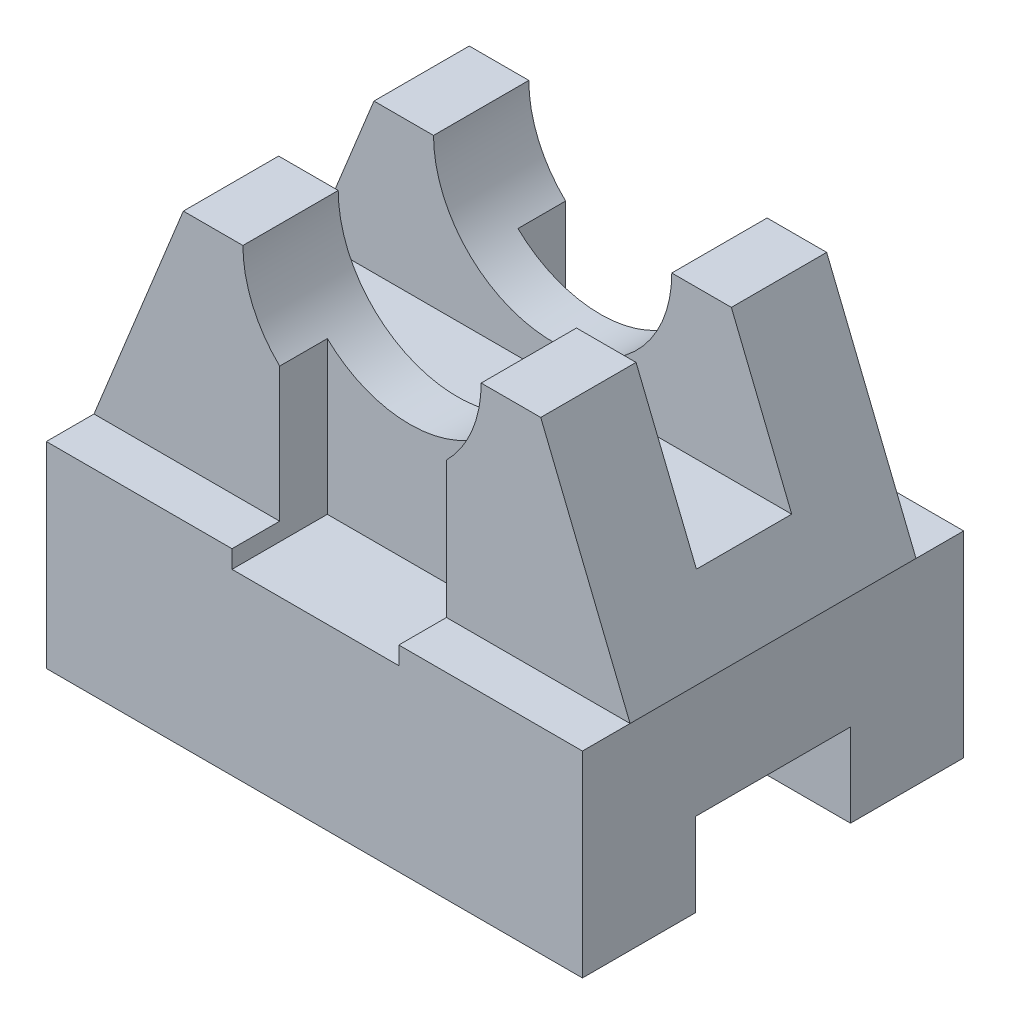
ISO-10303-21;
HEADER;
FILE_DESCRIPTION(('STEP AP214'),'2;1');
FILE_NAME('part.step','',(''),(''),'','','');
FILE_SCHEMA(('AUTOMOTIVE_DESIGN { 1 0 10303 214 1 1 1 1 }'));
ENDSEC;
DATA;
#1=APPLICATION_CONTEXT('core data for automotive mechanical design processes');
#2=APPLICATION_PROTOCOL_DEFINITION('international standard','automotive_design',2000,#1);
#3=PRODUCT_CONTEXT('',#1,'mechanical');
#4=PRODUCT('Part','Part','',(#3));
#5=PRODUCT_RELATED_PRODUCT_CATEGORY('part','',(#4));
#6=PRODUCT_DEFINITION_FORMATION('','',#4);
#7=PRODUCT_DEFINITION_CONTEXT('part definition',#1,'design');
#8=PRODUCT_DEFINITION('design','',#6,#7);
#9=PRODUCT_DEFINITION_SHAPE('','',#8);
#10=(LENGTH_UNIT() NAMED_UNIT(*) SI_UNIT(.MILLI.,.METRE.));
#11=(NAMED_UNIT(*) PLANE_ANGLE_UNIT() SI_UNIT($,.RADIAN.));
#12=(NAMED_UNIT(*) SI_UNIT($,.STERADIAN.) SOLID_ANGLE_UNIT());
#13=UNCERTAINTY_MEASURE_WITH_UNIT(LENGTH_MEASURE(1.E-05),#10,'distance_accuracy_value','');
#14=(GEOMETRIC_REPRESENTATION_CONTEXT(3) GLOBAL_UNCERTAINTY_ASSIGNED_CONTEXT((#13)) GLOBAL_UNIT_ASSIGNED_CONTEXT((#10,
#11,#12)) REPRESENTATION_CONTEXT('',''));
#15=CARTESIAN_POINT('',(0.,0.,0.));
#16=DIRECTION('',(0.,0.,1.));
#17=DIRECTION('',(1.,0.,0.));
#18=AXIS2_PLACEMENT_3D('',#15,#16,#17);
#19=CARTESIAN_POINT('',(0.,70.,24.));
#20=DIRECTION('',(0.,0.,-1.));
#21=DIRECTION('',(-1.,0.,0.));
#22=AXIS2_PLACEMENT_3D('',#19,#20,#21);
#23=CYLINDRICAL_SURFACE('',#22,20.);
#24=CARTESIAN_POINT('',(0.,70.,-16.));
#25=DIRECTION('',(0.,0.,-1.));
#26=DIRECTION('',(-1.,0.,0.));
#27=AXIS2_PLACEMENT_3D('',#24,#25,#26);
#28=CIRCLE('',#27,20.);
#29=CARTESIAN_POINT('',(14.1737173631196,55.8895168009595,-16.));
#30=VERTEX_POINT('',#29);
#31=CARTESIAN_POINT('',(-13.8262826368804,55.5489132434582,-16.));
#32=VERTEX_POINT('',#31);
#33=EDGE_CURVE('E11',#30,#32,#28,.T.);
#34=ORIENTED_EDGE('',*,*,#33,.T.);
#35=DIRECTION('',(0.,0.,-1.));
#36=VECTOR('',#35,1.);
#37=CARTESIAN_POINT('',(-13.8262826368804,55.5489132434582,24.));
#38=LINE('',#37,#36);
#39=CARTESIAN_POINT('',(-13.8262826368804,55.5489132434582,-24.));
#40=VERTEX_POINT('',#39);
#41=EDGE_CURVE('E262',#32,#40,#38,.T.);
#42=ORIENTED_EDGE('',*,*,#41,.T.);
#43=CARTESIAN_POINT('',(0.,70.,-24.));
#44=DIRECTION('',(0.,0.,1.));
#45=DIRECTION('',(1.,0.,0.));
#46=AXIS2_PLACEMENT_3D('',#43,#44,#45);
#47=CIRCLE('',#46,20.);
#48=CARTESIAN_POINT('',(-20.,70.,-24.));
#49=VERTEX_POINT('',#48);
#50=EDGE_CURVE('E375',#49,#40,#47,.T.);
#51=ORIENTED_EDGE('',*,*,#50,.F.);
#52=DIRECTION('',(0.,0.,-1.));
#53=VECTOR('',#52,1.);
#54=CARTESIAN_POINT('',(-20.,70.,24.));
#55=LINE('',#54,#53);
#56=CARTESIAN_POINT('',(-20.,70.,-8.));
#57=VERTEX_POINT('',#56);
#58=EDGE_CURVE('E355',#57,#49,#55,.T.);
#59=ORIENTED_EDGE('',*,*,#58,.F.);
#60=CARTESIAN_POINT('',(0.,70.,-8.));
#61=DIRECTION('',(0.,0.,-1.));
#62=DIRECTION('',(-1.,0.,0.));
#63=AXIS2_PLACEMENT_3D('',#60,#61,#62);
#64=CIRCLE('',#63,20.);
#65=CARTESIAN_POINT('',(20.,70.,-8.));
#66=VERTEX_POINT('',#65);
#67=EDGE_CURVE('E335',#66,#57,#64,.T.);
#68=ORIENTED_EDGE('',*,*,#67,.F.);
#69=DIRECTION('',(0.,0.,-1.));
#70=VECTOR('',#69,1.);
#71=CARTESIAN_POINT('',(20.,70.,24.));
#72=LINE('',#71,#70);
#73=CARTESIAN_POINT('',(20.,70.,-24.));
#74=VERTEX_POINT('',#73);
#75=EDGE_CURVE('E374',#66,#74,#72,.T.);
#76=ORIENTED_EDGE('',*,*,#75,.T.);
#77=CARTESIAN_POINT('',(14.1737173631196,55.8895168009595,-24.));
#78=VERTEX_POINT('',#77);
#79=EDGE_CURVE('E359',#78,#74,#47,.T.);
#80=ORIENTED_EDGE('',*,*,#79,.F.);
#81=DIRECTION('',(0.,0.,-1.));
#82=VECTOR('',#81,1.);
#83=CARTESIAN_POINT('',(14.1737173631196,55.8895168009595,24.));
#84=LINE('',#83,#82);
#85=EDGE_CURVE('E50',#78,#30,#84,.F.);
#86=ORIENTED_EDGE('',*,*,#85,.T.);
#87=EDGE_LOOP('',(#34,#42,#51,#59,#68,#76,#80,#86));
#88=FACE_BOUND('',#87,.T.);
#89=ADVANCED_FACE('F35',(#88),#23,.F.);
#90=CARTESIAN_POINT('',(0.,33.,0.));
#91=DIRECTION('',(0.,1.,0.));
#92=DIRECTION('',(0.,0.,1.));
#93=AXIS2_PLACEMENT_3D('',#90,#91,#92);
#94=PLANE('',#93);
#95=DIRECTION('',(-1.,0.,0.));
#96=VECTOR('',#95,1.);
#97=CARTESIAN_POINT('',(0.,33.,-24.));
#98=LINE('',#97,#96);
#99=CARTESIAN_POINT('',(-13.8262826368804,33.,-24.));
#100=VERTEX_POINT('',#99);
#101=CARTESIAN_POINT('',(-45.,33.,-24.));
#102=VERTEX_POINT('',#101);
#103=EDGE_CURVE('E378',#100,#102,#98,.T.);
#104=ORIENTED_EDGE('',*,*,#103,.F.);
#105=DIRECTION('',(0.,0.,-1.));
#106=VECTOR('',#105,1.);
#107=CARTESIAN_POINT('',(-13.8262826368804,33.,0.));
#108=LINE('',#107,#106);
#109=CARTESIAN_POINT('',(-13.8262826368804,33.,-32.));
#110=VERTEX_POINT('',#109);
#111=EDGE_CURVE('E281',#100,#110,#108,.T.);
#112=ORIENTED_EDGE('',*,*,#111,.T.);
#113=DIRECTION('',(-1.,0.,0.));
#114=VECTOR('',#113,1.);
#115=CARTESIAN_POINT('',(-45.,33.,-32.));
#116=LINE('',#115,#114);
#117=CARTESIAN_POINT('',(-45.,33.,-32.));
#118=VERTEX_POINT('',#117);
#119=EDGE_CURVE('E427',#110,#118,#116,.T.);
#120=ORIENTED_EDGE('',*,*,#119,.T.);
#121=DIRECTION('',(0.,0.,1.));
#122=VECTOR('',#121,1.);
#123=CARTESIAN_POINT('',(-45.,33.,-32.));
#124=LINE('',#123,#122);
#125=EDGE_CURVE('E433',#118,#102,#124,.T.);
#126=ORIENTED_EDGE('',*,*,#125,.T.);
#127=EDGE_LOOP('',(#104,#112,#120,#126));
#128=FACE_BOUND('',#127,.T.);
#129=ADVANCED_FACE('F531',(#128),#94,.T.);
#130=CARTESIAN_POINT('',(45.,33.,-32.));
#131=VERTEX_POINT('',#130);
#132=CARTESIAN_POINT('',(14.1737173631196,33.,-32.));
#133=VERTEX_POINT('',#132);
#134=EDGE_CURVE('E429',#131,#133,#116,.T.);
#135=ORIENTED_EDGE('',*,*,#134,.T.);
#136=DIRECTION('',(0.,0.,1.));
#137=VECTOR('',#136,1.);
#138=CARTESIAN_POINT('',(14.1737173631196,33.,0.));
#139=LINE('',#138,#137);
#140=CARTESIAN_POINT('',(14.1737173631196,33.,-24.));
#141=VERTEX_POINT('',#140);
#142=EDGE_CURVE('E273',#133,#141,#139,.T.);
#143=ORIENTED_EDGE('',*,*,#142,.T.);
#144=CARTESIAN_POINT('',(45.,33.,-24.));
#145=VERTEX_POINT('',#144);
#146=EDGE_CURVE('E379',#145,#141,#98,.T.);
#147=ORIENTED_EDGE('',*,*,#146,.F.);
#148=DIRECTION('',(0.,0.,-1.));
#149=VECTOR('',#148,1.);
#150=CARTESIAN_POINT('',(45.,33.,-32.));
#151=LINE('',#150,#149);
#152=EDGE_CURVE('E428',#145,#131,#151,.T.);
#153=ORIENTED_EDGE('',*,*,#152,.T.);
#154=EDGE_LOOP('',(#135,#143,#147,#153));
#155=FACE_BOUND('',#154,.T.);
#156=ADVANCED_FACE('F507',(#155),#94,.T.);
#157=CARTESIAN_POINT('',(-45.,33.,-32.));
#158=DIRECTION('',(0.,0.,1.));
#159=DIRECTION('',(1.,0.,0.));
#160=AXIS2_PLACEMENT_3D('',#157,#158,#159);
#161=PLANE('',#160);
#162=DIRECTION('',(0.,1.,0.));
#163=VECTOR('',#162,1.);
#164=CARTESIAN_POINT('',(-13.8262826368804,30.,-32.));
#165=LINE('',#164,#163);
#166=CARTESIAN_POINT('',(-13.8262826368804,30.,-32.));
#167=VERTEX_POINT('',#166);
#168=EDGE_CURVE('E271',#167,#110,#165,.T.);
#169=ORIENTED_EDGE('',*,*,#168,.F.);
#170=DIRECTION('',(1.,0.,0.));
#171=VECTOR('',#170,1.);
#172=CARTESIAN_POINT('',(-13.8262826368804,30.,-32.));
#173=LINE('',#172,#171);
#174=CARTESIAN_POINT('',(14.1737173631196,30.,-32.));
#175=VERTEX_POINT('',#174);
#176=EDGE_CURVE('E263',#167,#175,#173,.T.);
#177=ORIENTED_EDGE('',*,*,#176,.T.);
#178=DIRECTION('',(0.,1.,0.));
#179=VECTOR('',#178,1.);
#180=CARTESIAN_POINT('',(14.1737173631196,30.,-32.));
#181=LINE('',#180,#179);
#182=EDGE_CURVE('E274',#175,#133,#181,.T.);
#183=ORIENTED_EDGE('',*,*,#182,.T.);
#184=ORIENTED_EDGE('',*,*,#134,.F.);
#185=DIRECTION('',(0.,-1.,0.));
#186=VECTOR('',#185,1.);
#187=CARTESIAN_POINT('',(45.,33.,-32.));
#188=LINE('',#187,#186);
#189=CARTESIAN_POINT('',(45.,0.,-32.));
#190=VERTEX_POINT('',#189);
#191=EDGE_CURVE('E460',#131,#190,#188,.T.);
#192=ORIENTED_EDGE('',*,*,#191,.T.);
#193=DIRECTION('',(-1.,0.,0.));
#194=VECTOR('',#193,1.);
#195=CARTESIAN_POINT('',(-45.,0.,-32.));
#196=LINE('',#195,#194);
#197=CARTESIAN_POINT('',(-45.,0.,-32.));
#198=VERTEX_POINT('',#197);
#199=EDGE_CURVE('E444',#190,#198,#196,.T.);
#200=ORIENTED_EDGE('',*,*,#199,.T.);
#201=DIRECTION('',(0.,-1.,0.));
#202=VECTOR('',#201,1.);
#203=CARTESIAN_POINT('',(-45.,33.,-32.));
#204=LINE('',#203,#202);
#205=EDGE_CURVE('E457',#118,#198,#204,.T.);
#206=ORIENTED_EDGE('',*,*,#205,.F.);
#207=ORIENTED_EDGE('',*,*,#119,.F.);
#208=EDGE_LOOP('',(#169,#177,#183,#184,#192,#200,#206,#207));
#209=FACE_BOUND('',#208,.T.);
#210=ADVANCED_FACE('F512',(#209),#161,.F.);
#211=CARTESIAN_POINT('',(0.,0.,-24.));
#212=DIRECTION('',(0.,0.,1.));
#213=DIRECTION('',(1.,0.,0.));
#214=AXIS2_PLACEMENT_3D('',#211,#212,#213);
#215=PLANE('',#214);
#216=DIRECTION('',(0.,1.,0.));
#217=VECTOR('',#216,1.);
#218=CARTESIAN_POINT('',(-13.8262826368804,0.,-24.));
#219=LINE('',#218,#217);
#220=EDGE_CURVE('E43',#100,#40,#219,.T.);
#221=ORIENTED_EDGE('',*,*,#220,.F.);
#222=ORIENTED_EDGE('',*,*,#103,.T.);
#223=DIRECTION('',(-0.375705108739218,-0.926739268223405,0.));
#224=VECTOR('',#223,1.);
#225=CARTESIAN_POINT('',(-50.138017565872,20.3262233375157,-24.));
#226=LINE('',#225,#224);
#227=CARTESIAN_POINT('',(-30.,70.,-24.));
#228=VERTEX_POINT('',#227);
#229=EDGE_CURVE('E341',#228,#102,#226,.T.);
#230=ORIENTED_EDGE('',*,*,#229,.F.);
#231=DIRECTION('',(-1.,0.,0.));
#232=VECTOR('',#231,1.);
#233=CARTESIAN_POINT('',(0.,70.,-24.));
#234=LINE('',#233,#232);
#235=EDGE_CURVE('E337',#49,#228,#234,.T.);
#236=ORIENTED_EDGE('',*,*,#235,.F.);
#237=ORIENTED_EDGE('',*,*,#50,.T.);
#238=EDGE_LOOP('',(#221,#222,#230,#236,#237));
#239=FACE_BOUND('',#238,.T.);
#240=ADVANCED_FACE('F485',(#239),#215,.F.);
#241=DIRECTION('',(0.,-1.,0.));
#242=VECTOR('',#241,1.);
#243=CARTESIAN_POINT('',(14.1737173631196,0.,-24.));
#244=LINE('',#243,#242);
#245=EDGE_CURVE('E477',#78,#141,#244,.T.);
#246=ORIENTED_EDGE('',*,*,#245,.F.);
#247=ORIENTED_EDGE('',*,*,#79,.T.);
#248=DIRECTION('',(1.,0.,0.));
#249=VECTOR('',#248,1.);
#250=CARTESIAN_POINT('',(0.,70.,-24.));
#251=LINE('',#250,#249);
#252=CARTESIAN_POINT('',(30.,70.,-24.));
#253=VERTEX_POINT('',#252);
#254=EDGE_CURVE('E385',#74,#253,#251,.T.);
#255=ORIENTED_EDGE('',*,*,#254,.T.);
#256=DIRECTION('',(0.375705108739218,-0.926739268223405,0.));
#257=VECTOR('',#256,1.);
#258=CARTESIAN_POINT('',(50.138017565872,20.3262233375157,-24.));
#259=LINE('',#258,#257);
#260=EDGE_CURVE('E382',#253,#145,#259,.T.);
#261=ORIENTED_EDGE('',*,*,#260,.T.);
#262=ORIENTED_EDGE('',*,*,#146,.T.);
#263=EDGE_LOOP('',(#246,#247,#255,#261,#262));
#264=FACE_BOUND('',#263,.T.);
#265=ADVANCED_FACE('F503',(#264),#215,.F.);
#266=DIRECTION('',(0.,0.,1.));
#267=VECTOR('',#266,1.);
#268=CARTESIAN_POINT('',(-13.8262826368804,33.,0.));
#269=LINE('',#268,#267);
#270=CARTESIAN_POINT('',(-13.8262826368804,33.,24.));
#271=VERTEX_POINT('',#270);
#272=CARTESIAN_POINT('',(-13.8262826368804,33.,32.));
#273=VERTEX_POINT('',#272);
#274=EDGE_CURVE('E313',#271,#273,#269,.T.);
#275=ORIENTED_EDGE('',*,*,#274,.F.);
#276=DIRECTION('',(-1.,0.,0.));
#277=VECTOR('',#276,1.);
#278=CARTESIAN_POINT('',(0.,33.,24.));
#279=LINE('',#278,#277);
#280=CARTESIAN_POINT('',(-45.,33.,24.));
#281=VERTEX_POINT('',#280);
#282=EDGE_CURVE('E363',#271,#281,#279,.T.);
#283=ORIENTED_EDGE('',*,*,#282,.T.);
#284=CARTESIAN_POINT('',(-45.,33.,32.));
#285=VERTEX_POINT('',#284);
#286=EDGE_CURVE('E432',#281,#285,#124,.T.);
#287=ORIENTED_EDGE('',*,*,#286,.T.);
#288=DIRECTION('',(1.,0.,0.));
#289=VECTOR('',#288,1.);
#290=CARTESIAN_POINT('',(-45.,33.,32.));
#291=LINE('',#290,#289);
#292=EDGE_CURVE('E437',#285,#273,#291,.T.);
#293=ORIENTED_EDGE('',*,*,#292,.T.);
#294=EDGE_LOOP('',(#275,#283,#287,#293));
#295=FACE_BOUND('',#294,.T.);
#296=ADVANCED_FACE('F599',(#295),#94,.T.);
#297=CARTESIAN_POINT('',(0.,0.,24.));
#298=DIRECTION('',(0.,0.,1.));
#299=DIRECTION('',(1.,0.,0.));
#300=AXIS2_PLACEMENT_3D('',#297,#298,#299);
#301=PLANE('',#300);
#302=DIRECTION('',(0.,-1.,0.));
#303=VECTOR('',#302,1.);
#304=CARTESIAN_POINT('',(-13.8262826368804,0.,24.));
#305=LINE('',#304,#303);
#306=CARTESIAN_POINT('',(-13.8262826368804,55.5489132434582,24.));
#307=VERTEX_POINT('',#306);
#308=EDGE_CURVE('E473',#307,#271,#305,.T.);
#309=ORIENTED_EDGE('',*,*,#308,.F.);
#310=CARTESIAN_POINT('',(0.,70.,24.));
#311=DIRECTION('',(0.,0.,1.));
#312=DIRECTION('',(1.,0.,0.));
#313=AXIS2_PLACEMENT_3D('',#310,#311,#312);
#314=CIRCLE('',#313,20.);
#315=CARTESIAN_POINT('',(-20.,70.,24.));
#316=VERTEX_POINT('',#315);
#317=EDGE_CURVE('E360',#316,#307,#314,.T.);
#318=ORIENTED_EDGE('',*,*,#317,.F.);
#319=DIRECTION('',(-1.,0.,0.));
#320=VECTOR('',#319,1.);
#321=CARTESIAN_POINT('',(0.,70.,24.));
#322=LINE('',#321,#320);
#323=CARTESIAN_POINT('',(-30.,70.,24.));
#324=VERTEX_POINT('',#323);
#325=EDGE_CURVE('E338',#316,#324,#322,.T.);
#326=ORIENTED_EDGE('',*,*,#325,.T.);
#327=DIRECTION('',(-0.375705108739218,-0.926739268223405,0.));
#328=VECTOR('',#327,1.);
#329=CARTESIAN_POINT('',(-50.138017565872,20.3262233375157,24.));
#330=LINE('',#329,#328);
#331=EDGE_CURVE('E340',#324,#281,#330,.T.);
#332=ORIENTED_EDGE('',*,*,#331,.T.);
#333=ORIENTED_EDGE('',*,*,#282,.F.);
#334=EDGE_LOOP('',(#309,#318,#326,#332,#333));
#335=FACE_BOUND('',#334,.T.);
#336=ADVANCED_FACE('F611',(#335),#301,.T.);
#337=CARTESIAN_POINT('',(0.,70.,24.));
#338=DIRECTION('',(0.,1.,0.));
#339=DIRECTION('',(0.,0.,1.));
#340=AXIS2_PLACEMENT_3D('',#337,#338,#339);
#341=PLANE('',#340);
#342=DIRECTION('',(-1.,0.,0.));
#343=VECTOR('',#342,1.);
#344=CARTESIAN_POINT('',(43.4465066165259,70.,-8.00000000000001));
#345=LINE('',#344,#343);
#346=CARTESIAN_POINT('',(30.,70.,-8.));
#347=VERTEX_POINT('',#346);
#348=EDGE_CURVE('E320',#347,#66,#345,.T.);
#349=ORIENTED_EDGE('',*,*,#348,.F.);
#350=DIRECTION('',(0.,0.,-1.));
#351=VECTOR('',#350,1.);
#352=CARTESIAN_POINT('',(30.,70.,24.));
#353=LINE('',#352,#351);
#354=EDGE_CURVE('E391',#347,#253,#353,.T.);
#355=ORIENTED_EDGE('',*,*,#354,.T.);
#356=ORIENTED_EDGE('',*,*,#254,.F.);
#357=ORIENTED_EDGE('',*,*,#75,.F.);
#358=EDGE_LOOP('',(#349,#355,#356,#357));
#359=FACE_BOUND('',#358,.T.);
#360=ADVANCED_FACE('F499',(#359),#341,.T.);
#361=CARTESIAN_POINT('',(0.,70.,24.));
#362=DIRECTION('',(0.,-1.,0.));
#363=DIRECTION('',(0.,0.,-1.));
#364=AXIS2_PLACEMENT_3D('',#361,#362,#363);
#365=PLANE('',#364);
#366=DIRECTION('',(0.,0.,-1.));
#367=VECTOR('',#366,1.);
#368=CARTESIAN_POINT('',(-30.,70.,24.));
#369=LINE('',#368,#367);
#370=CARTESIAN_POINT('',(-30.,70.,-8.));
#371=VERTEX_POINT('',#370);
#372=EDGE_CURVE('E351',#371,#228,#369,.T.);
#373=ORIENTED_EDGE('',*,*,#372,.F.);
#374=EDGE_CURVE('E325',#57,#371,#345,.T.);
#375=ORIENTED_EDGE('',*,*,#374,.F.);
#376=ORIENTED_EDGE('',*,*,#58,.T.);
#377=ORIENTED_EDGE('',*,*,#235,.T.);
#378=EDGE_LOOP('',(#373,#375,#376,#377));
#379=FACE_BOUND('',#378,.T.);
#380=ADVANCED_FACE('F489',(#379),#365,.F.);
#381=CARTESIAN_POINT('',(0.,0.,0.));
#382=DIRECTION('',(0.,1.,0.));
#383=DIRECTION('',(0.,0.,1.));
#384=AXIS2_PLACEMENT_3D('',#381,#382,#383);
#385=PLANE('',#384);
#386=DIRECTION('',(0.,0.,1.));
#387=VECTOR('',#386,1.);
#388=CARTESIAN_POINT('',(-45.,0.,-32.));
#389=LINE('',#388,#387);
#390=CARTESIAN_POINT('',(-45.,0.,13.));
#391=VERTEX_POINT('',#390);
#392=CARTESIAN_POINT('',(-45.,0.,32.));
#393=VERTEX_POINT('',#392);
#394=EDGE_CURVE('E446',#391,#393,#389,.T.);
#395=ORIENTED_EDGE('',*,*,#394,.F.);
#396=DIRECTION('',(1.,0.,0.));
#397=VECTOR('',#396,1.);
#398=CARTESIAN_POINT('',(-45.,0.,13.));
#399=LINE('',#398,#397);
#400=CARTESIAN_POINT('',(45.,0.,13.));
#401=VERTEX_POINT('',#400);
#402=EDGE_CURVE('E415',#391,#401,#399,.T.);
#403=ORIENTED_EDGE('',*,*,#402,.T.);
#404=DIRECTION('',(0.,0.,-1.));
#405=VECTOR('',#404,1.);
#406=CARTESIAN_POINT('',(45.,0.,-32.));
#407=LINE('',#406,#405);
#408=CARTESIAN_POINT('',(45.,0.,32.));
#409=VERTEX_POINT('',#408);
#410=EDGE_CURVE('E441',#409,#401,#407,.T.);
#411=ORIENTED_EDGE('',*,*,#410,.F.);
#412=DIRECTION('',(1.,0.,0.));
#413=VECTOR('',#412,1.);
#414=CARTESIAN_POINT('',(-45.,0.,32.));
#415=LINE('',#414,#413);
#416=EDGE_CURVE('E450',#393,#409,#415,.T.);
#417=ORIENTED_EDGE('',*,*,#416,.F.);
#418=EDGE_LOOP('',(#395,#403,#411,#417));
#419=FACE_BOUND('',#418,.T.);
#420=ADVANCED_FACE('F559',(#419),#385,.F.);
#421=CARTESIAN_POINT('',(45.,33.,-32.));
#422=DIRECTION('',(-1.,0.,0.));
#423=DIRECTION('',(0.,0.,1.));
#424=AXIS2_PLACEMENT_3D('',#421,#422,#423);
#425=PLANE('',#424);
#426=ORIENTED_EDGE('',*,*,#410,.T.);
#427=DIRECTION('',(0.,-1.,0.));
#428=VECTOR('',#427,1.);
#429=CARTESIAN_POINT('',(45.,0.,13.));
#430=LINE('',#429,#428);
#431=CARTESIAN_POINT('',(45.,14.,13.));
#432=VERTEX_POINT('',#431);
#433=EDGE_CURVE('E402',#432,#401,#430,.T.);
#434=ORIENTED_EDGE('',*,*,#433,.F.);
#435=DIRECTION('',(0.,0.,1.));
#436=VECTOR('',#435,1.);
#437=CARTESIAN_POINT('',(45.,14.,-13.));
#438=LINE('',#437,#436);
#439=CARTESIAN_POINT('',(45.,14.,-13.));
#440=VERTEX_POINT('',#439);
#441=EDGE_CURVE('E411',#440,#432,#438,.T.);
#442=ORIENTED_EDGE('',*,*,#441,.F.);
#443=DIRECTION('',(0.,1.,0.));
#444=VECTOR('',#443,1.);
#445=CARTESIAN_POINT('',(45.,0.,-13.));
#446=LINE('',#445,#444);
#447=CARTESIAN_POINT('',(45.,0.,-13.));
#448=VERTEX_POINT('',#447);
#449=EDGE_CURVE('E397',#448,#440,#446,.T.);
#450=ORIENTED_EDGE('',*,*,#449,.F.);
#451=EDGE_CURVE('E418',#448,#190,#407,.T.);
#452=ORIENTED_EDGE('',*,*,#451,.T.);
#453=ORIENTED_EDGE('',*,*,#191,.F.);
#454=ORIENTED_EDGE('',*,*,#152,.F.);
#455=DIRECTION('',(0.,0.,-1.));
#456=VECTOR('',#455,1.);
#457=CARTESIAN_POINT('',(45.,33.,24.));
#458=LINE('',#457,#456);
#459=CARTESIAN_POINT('',(45.,33.,24.));
#460=VERTEX_POINT('',#459);
#461=EDGE_CURVE('E395',#460,#145,#458,.T.);
#462=ORIENTED_EDGE('',*,*,#461,.F.);
#463=CARTESIAN_POINT('',(45.,33.,32.));
#464=VERTEX_POINT('',#463);
#465=EDGE_CURVE('E424',#464,#460,#151,.T.);
#466=ORIENTED_EDGE('',*,*,#465,.F.);
#467=DIRECTION('',(0.,-1.,0.));
#468=VECTOR('',#467,1.);
#469=CARTESIAN_POINT('',(45.,33.,32.));
#470=LINE('',#469,#468);
#471=EDGE_CURVE('E440',#464,#409,#470,.T.);
#472=ORIENTED_EDGE('',*,*,#471,.T.);
#473=EDGE_LOOP('',(#426,#434,#442,#450,#452,#453,#454,#462,#466,#472));
#474=FACE_BOUND('',#473,.T.);
#475=ADVANCED_FACE('F37',(#474),#425,.F.);
#476=CARTESIAN_POINT('',(-45.,33.,-32.));
#477=DIRECTION('',(1.,0.,0.));
#478=DIRECTION('',(0.,0.,-1.));
#479=AXIS2_PLACEMENT_3D('',#476,#477,#478);
#480=PLANE('',#479);
#481=DIRECTION('',(0.,0.,1.));
#482=VECTOR('',#481,1.);
#483=CARTESIAN_POINT('',(-45.,14.,-13.));
#484=LINE('',#483,#482);
#485=CARTESIAN_POINT('',(-45.,14.,-13.));
#486=VERTEX_POINT('',#485);
#487=CARTESIAN_POINT('',(-45.,14.,13.));
#488=VERTEX_POINT('',#487);
#489=EDGE_CURVE('E401',#486,#488,#484,.T.);
#490=ORIENTED_EDGE('',*,*,#489,.T.);
#491=DIRECTION('',(0.,-1.,0.));
#492=VECTOR('',#491,1.);
#493=CARTESIAN_POINT('',(-45.,0.,13.));
#494=LINE('',#493,#492);
#495=EDGE_CURVE('E405',#488,#391,#494,.T.);
#496=ORIENTED_EDGE('',*,*,#495,.T.);
#497=ORIENTED_EDGE('',*,*,#394,.T.);
#498=DIRECTION('',(0.,-1.,0.));
#499=VECTOR('',#498,1.);
#500=CARTESIAN_POINT('',(-45.,33.,32.));
#501=LINE('',#500,#499);
#502=EDGE_CURVE('E454',#285,#393,#501,.T.);
#503=ORIENTED_EDGE('',*,*,#502,.F.);
#504=ORIENTED_EDGE('',*,*,#286,.F.);
#505=DIRECTION('',(0.,0.,-1.));
#506=VECTOR('',#505,1.);
#507=CARTESIAN_POINT('',(-45.,33.,24.));
#508=LINE('',#507,#506);
#509=EDGE_CURVE('E344',#281,#102,#508,.T.);
#510=ORIENTED_EDGE('',*,*,#509,.T.);
#511=ORIENTED_EDGE('',*,*,#125,.F.);
#512=ORIENTED_EDGE('',*,*,#205,.T.);
#513=CARTESIAN_POINT('',(-45.,0.,-13.));
#514=VERTEX_POINT('',#513);
#515=EDGE_CURVE('E447',#198,#514,#389,.T.);
#516=ORIENTED_EDGE('',*,*,#515,.T.);
#517=DIRECTION('',(0.,1.,0.));
#518=VECTOR('',#517,1.);
#519=CARTESIAN_POINT('',(-45.,0.,-13.));
#520=LINE('',#519,#518);
#521=EDGE_CURVE('E398',#514,#486,#520,.T.);
#522=ORIENTED_EDGE('',*,*,#521,.T.);
#523=EDGE_LOOP('',(#490,#496,#497,#503,#504,#510,#511,#512,#516,#522));
#524=FACE_BOUND('',#523,.T.);
#525=ADVANCED_FACE('F527',(#524),#480,.F.);
#526=CARTESIAN_POINT('',(-45.,33.,32.));
#527=DIRECTION('',(0.,0.,-1.));
#528=DIRECTION('',(-1.,0.,0.));
#529=AXIS2_PLACEMENT_3D('',#526,#527,#528);
#530=PLANE('',#529);
#531=DIRECTION('',(1.,0.,0.));
#532=VECTOR('',#531,1.);
#533=CARTESIAN_POINT('',(-13.8262826368804,30.,32.));
#534=LINE('',#533,#532);
#535=CARTESIAN_POINT('',(-13.8262826368804,30.,32.));
#536=VERTEX_POINT('',#535);
#537=CARTESIAN_POINT('',(14.1737173631196,30.,32.));
#538=VERTEX_POINT('',#537);
#539=EDGE_CURVE('E288',#536,#538,#534,.T.);
#540=ORIENTED_EDGE('',*,*,#539,.F.);
#541=DIRECTION('',(0.,1.,0.));
#542=VECTOR('',#541,1.);
#543=CARTESIAN_POINT('',(-13.8262826368804,30.,32.));
#544=LINE('',#543,#542);
#545=EDGE_CURVE('E297',#536,#273,#544,.T.);
#546=ORIENTED_EDGE('',*,*,#545,.T.);
#547=ORIENTED_EDGE('',*,*,#292,.F.);
#548=ORIENTED_EDGE('',*,*,#502,.T.);
#549=ORIENTED_EDGE('',*,*,#416,.T.);
#550=ORIENTED_EDGE('',*,*,#471,.F.);
#551=CARTESIAN_POINT('',(14.1737173631196,33.,32.));
#552=VERTEX_POINT('',#551);
#553=EDGE_CURVE('E436',#552,#464,#291,.T.);
#554=ORIENTED_EDGE('',*,*,#553,.F.);
#555=DIRECTION('',(0.,1.,0.));
#556=VECTOR('',#555,1.);
#557=CARTESIAN_POINT('',(14.1737173631196,30.,32.));
#558=LINE('',#557,#556);
#559=EDGE_CURVE('E305',#538,#552,#558,.T.);
#560=ORIENTED_EDGE('',*,*,#559,.F.);
#561=EDGE_LOOP('',(#540,#546,#547,#548,#549,#550,#554,#560));
#562=FACE_BOUND('',#561,.T.);
#563=ADVANCED_FACE('F553',(#562),#530,.F.);
#564=DIRECTION('',(0.,0.,-1.));
#565=VECTOR('',#564,1.);
#566=CARTESIAN_POINT('',(14.1737173631196,33.,0.));
#567=LINE('',#566,#565);
#568=CARTESIAN_POINT('',(14.1737173631196,33.,24.));
#569=VERTEX_POINT('',#568);
#570=EDGE_CURVE('E58',#552,#569,#567,.T.);
#571=ORIENTED_EDGE('',*,*,#570,.F.);
#572=ORIENTED_EDGE('',*,*,#553,.T.);
#573=ORIENTED_EDGE('',*,*,#465,.T.);
#574=EDGE_CURVE('E365',#460,#569,#279,.T.);
#575=ORIENTED_EDGE('',*,*,#574,.T.);
#576=EDGE_LOOP('',(#571,#572,#573,#575));
#577=FACE_BOUND('',#576,.T.);
#578=ADVANCED_FACE('F547',(#577),#94,.T.);
#579=ORIENTED_EDGE('',*,*,#451,.F.);
#580=DIRECTION('',(1.,0.,0.));
#581=VECTOR('',#580,1.);
#582=CARTESIAN_POINT('',(-45.,0.,-13.));
#583=LINE('',#582,#581);
#584=EDGE_CURVE('E408',#514,#448,#583,.T.);
#585=ORIENTED_EDGE('',*,*,#584,.F.);
#586=ORIENTED_EDGE('',*,*,#515,.F.);
#587=ORIENTED_EDGE('',*,*,#199,.F.);
#588=EDGE_LOOP('',(#579,#585,#586,#587));
#589=FACE_BOUND('',#588,.T.);
#590=ADVANCED_FACE('F522',(#589),#385,.F.);
#591=CARTESIAN_POINT('',(-45.,0.,13.));
#592=DIRECTION('',(0.,0.,1.));
#593=DIRECTION('',(0.,-1.,0.));
#594=AXIS2_PLACEMENT_3D('',#591,#592,#593);
#595=PLANE('',#594);
#596=ORIENTED_EDGE('',*,*,#433,.T.);
#597=ORIENTED_EDGE('',*,*,#402,.F.);
#598=ORIENTED_EDGE('',*,*,#495,.F.);
#599=DIRECTION('',(1.,0.,0.));
#600=VECTOR('',#599,1.);
#601=CARTESIAN_POINT('',(-45.,14.,13.));
#602=LINE('',#601,#600);
#603=EDGE_CURVE('E419',#488,#432,#602,.T.);
#604=ORIENTED_EDGE('',*,*,#603,.T.);
#605=EDGE_LOOP('',(#596,#597,#598,#604));
#606=FACE_BOUND('',#605,.T.);
#607=ADVANCED_FACE('F562',(#606),#595,.F.);
#608=CARTESIAN_POINT('',(-45.,14.,-13.));
#609=DIRECTION('',(0.,1.,0.));
#610=DIRECTION('',(0.,0.,1.));
#611=AXIS2_PLACEMENT_3D('',#608,#609,#610);
#612=PLANE('',#611);
#613=ORIENTED_EDGE('',*,*,#441,.T.);
#614=ORIENTED_EDGE('',*,*,#603,.F.);
#615=ORIENTED_EDGE('',*,*,#489,.F.);
#616=DIRECTION('',(1.,0.,0.));
#617=VECTOR('',#616,1.);
#618=CARTESIAN_POINT('',(-45.,14.,-13.));
#619=LINE('',#618,#617);
#620=EDGE_CURVE('E421',#486,#440,#619,.T.);
#621=ORIENTED_EDGE('',*,*,#620,.T.);
#622=EDGE_LOOP('',(#613,#614,#615,#621));
#623=FACE_BOUND('',#622,.T.);
#624=ADVANCED_FACE('F566',(#623),#612,.F.);
#625=CARTESIAN_POINT('',(-45.,0.,-13.));
#626=DIRECTION('',(0.,0.,-1.));
#627=DIRECTION('',(-1.,0.,0.));
#628=AXIS2_PLACEMENT_3D('',#625,#626,#627);
#629=PLANE('',#628);
#630=ORIENTED_EDGE('',*,*,#449,.T.);
#631=ORIENTED_EDGE('',*,*,#620,.F.);
#632=ORIENTED_EDGE('',*,*,#521,.F.);
#633=ORIENTED_EDGE('',*,*,#584,.T.);
#634=EDGE_LOOP('',(#630,#631,#632,#633));
#635=FACE_BOUND('',#634,.T.);
#636=ADVANCED_FACE('F568',(#635),#629,.F.);
#637=DIRECTION('',(0.,0.,-1.));
#638=VECTOR('',#637,1.);
#639=CARTESIAN_POINT('',(-13.8262826368804,55.5489132434582,24.));
#640=LINE('',#639,#638);
#641=CARTESIAN_POINT('',(-13.8262826368804,55.5489132434582,16.));
#642=VERTEX_POINT('',#641);
#643=EDGE_CURVE('E311',#642,#307,#640,.F.);
#644=ORIENTED_EDGE('',*,*,#643,.F.);
#645=CARTESIAN_POINT('',(0.,70.,16.));
#646=DIRECTION('',(0.,0.,-1.));
#647=DIRECTION('',(-1.,0.,0.));
#648=AXIS2_PLACEMENT_3D('',#645,#646,#647);
#649=CIRCLE('',#648,20.);
#650=CARTESIAN_POINT('',(14.1737173631196,55.8895168009595,16.));
#651=VERTEX_POINT('',#650);
#652=EDGE_CURVE('E475',#651,#642,#649,.T.);
#653=ORIENTED_EDGE('',*,*,#652,.F.);
#654=DIRECTION('',(0.,0.,-1.));
#655=VECTOR('',#654,1.);
#656=CARTESIAN_POINT('',(14.1737173631196,55.8895168009595,24.));
#657=LINE('',#656,#655);
#658=CARTESIAN_POINT('',(14.1737173631196,55.8895168009595,24.));
#659=VERTEX_POINT('',#658);
#660=EDGE_CURVE('E301',#659,#651,#657,.T.);
#661=ORIENTED_EDGE('',*,*,#660,.F.);
#662=CARTESIAN_POINT('',(20.,70.,24.));
#663=VERTEX_POINT('',#662);
#664=EDGE_CURVE('E364',#659,#663,#314,.T.);
#665=ORIENTED_EDGE('',*,*,#664,.T.);
#666=CARTESIAN_POINT('',(20.,70.,8.));
#667=VERTEX_POINT('',#666);
#668=EDGE_CURVE('E388',#663,#667,#72,.T.);
#669=ORIENTED_EDGE('',*,*,#668,.T.);
#670=CARTESIAN_POINT('',(0.,70.,8.));
#671=DIRECTION('',(0.,0.,1.));
#672=DIRECTION('',(1.,0.,0.));
#673=AXIS2_PLACEMENT_3D('',#670,#671,#672);
#674=CIRCLE('',#673,20.);
#675=CARTESIAN_POINT('',(-20.,70.,8.));
#676=VERTEX_POINT('',#675);
#677=EDGE_CURVE('E331',#676,#667,#674,.T.);
#678=ORIENTED_EDGE('',*,*,#677,.F.);
#679=EDGE_CURVE('E356',#316,#676,#55,.T.);
#680=ORIENTED_EDGE('',*,*,#679,.F.);
#681=ORIENTED_EDGE('',*,*,#317,.T.);
#682=EDGE_LOOP('',(#644,#653,#661,#665,#669,#678,#680,#681));
#683=FACE_BOUND('',#682,.T.);
#684=ADVANCED_FACE('F570',(#683),#23,.F.);
#685=CARTESIAN_POINT('',(50.138017565872,20.3262233375157,24.));
#686=DIRECTION('',(0.926739268223405,0.375705108739218,0.));
#687=DIRECTION('',(-0.375705108739218,0.926739268223405,0.));
#688=AXIS2_PLACEMENT_3D('',#685,#686,#687);
#689=PLANE('',#688);
#690=DIRECTION('',(-0.375705108739218,0.926739268223405,0.));
#691=VECTOR('',#690,1.);
#692=CARTESIAN_POINT('',(50.138017565872,20.3262233375157,-8.00000000000001));
#693=LINE('',#692,#691);
#694=CARTESIAN_POINT('',(40.1351351351351,45.,-8.00000000000001));
#695=VERTEX_POINT('',#694);
#696=EDGE_CURVE('E333',#695,#347,#693,.T.);
#697=ORIENTED_EDGE('',*,*,#696,.F.);
#698=DIRECTION('',(0.,0.,1.));
#699=VECTOR('',#698,1.);
#700=CARTESIAN_POINT('',(40.1351351351351,45.,24.));
#701=LINE('',#700,#699);
#702=CARTESIAN_POINT('',(40.1351351351351,45.,7.99999999999999));
#703=VERTEX_POINT('',#702);
#704=EDGE_CURVE('E322',#695,#703,#701,.T.);
#705=ORIENTED_EDGE('',*,*,#704,.T.);
#706=DIRECTION('',(0.375705108739218,-0.926739268223405,0.));
#707=VECTOR('',#706,1.);
#708=CARTESIAN_POINT('',(50.138017565872,20.3262233375157,7.99999999999999));
#709=LINE('',#708,#707);
#710=CARTESIAN_POINT('',(30.,70.,8.));
#711=VERTEX_POINT('',#710);
#712=EDGE_CURVE('E329',#711,#703,#709,.T.);
#713=ORIENTED_EDGE('',*,*,#712,.F.);
#714=CARTESIAN_POINT('',(30.,70.,24.));
#715=VERTEX_POINT('',#714);
#716=EDGE_CURVE('E392',#715,#711,#353,.T.);
#717=ORIENTED_EDGE('',*,*,#716,.F.);
#718=DIRECTION('',(0.375705108739218,-0.926739268223405,0.));
#719=VECTOR('',#718,1.);
#720=CARTESIAN_POINT('',(50.138017565872,20.3262233375157,24.));
#721=LINE('',#720,#719);
#722=EDGE_CURVE('E368',#715,#460,#721,.T.);
#723=ORIENTED_EDGE('',*,*,#722,.T.);
#724=ORIENTED_EDGE('',*,*,#461,.T.);
#725=ORIENTED_EDGE('',*,*,#260,.F.);
#726=ORIENTED_EDGE('',*,*,#354,.F.);
#727=EDGE_LOOP('',(#697,#705,#713,#717,#723,#724,#725,#726));
#728=FACE_BOUND('',#727,.T.);
#729=ADVANCED_FACE('F542',(#728),#689,.T.);
#730=DIRECTION('',(1.,0.,0.));
#731=VECTOR('',#730,1.);
#732=CARTESIAN_POINT('',(43.4465066165259,70.,7.99999999999999));
#733=LINE('',#732,#731);
#734=EDGE_CURVE('E315',#667,#711,#733,.T.);
#735=ORIENTED_EDGE('',*,*,#734,.F.);
#736=ORIENTED_EDGE('',*,*,#668,.F.);
#737=DIRECTION('',(1.,0.,0.));
#738=VECTOR('',#737,1.);
#739=CARTESIAN_POINT('',(0.,70.,24.));
#740=LINE('',#739,#738);
#741=EDGE_CURVE('E371',#663,#715,#740,.T.);
#742=ORIENTED_EDGE('',*,*,#741,.T.);
#743=ORIENTED_EDGE('',*,*,#716,.T.);
#744=EDGE_LOOP('',(#735,#736,#742,#743));
#745=FACE_BOUND('',#744,.T.);
#746=ADVANCED_FACE('F612',(#745),#341,.T.);
#747=DIRECTION('',(0.,1.,0.));
#748=VECTOR('',#747,1.);
#749=CARTESIAN_POINT('',(14.1737173631196,0.,24.));
#750=LINE('',#749,#748);
#751=EDGE_CURVE('E471',#569,#659,#750,.T.);
#752=ORIENTED_EDGE('',*,*,#751,.F.);
#753=ORIENTED_EDGE('',*,*,#574,.F.);
#754=ORIENTED_EDGE('',*,*,#722,.F.);
#755=ORIENTED_EDGE('',*,*,#741,.F.);
#756=ORIENTED_EDGE('',*,*,#664,.F.);
#757=EDGE_LOOP('',(#752,#753,#754,#755,#756));
#758=FACE_BOUND('',#757,.T.);
#759=ADVANCED_FACE('F616',(#758),#301,.T.);
#760=ORIENTED_EDGE('',*,*,#679,.T.);
#761=CARTESIAN_POINT('',(-30.,70.,8.));
#762=VERTEX_POINT('',#761);
#763=EDGE_CURVE('E324',#762,#676,#733,.T.);
#764=ORIENTED_EDGE('',*,*,#763,.F.);
#765=EDGE_CURVE('E352',#324,#762,#369,.T.);
#766=ORIENTED_EDGE('',*,*,#765,.F.);
#767=ORIENTED_EDGE('',*,*,#325,.F.);
#768=EDGE_LOOP('',(#760,#764,#766,#767));
#769=FACE_BOUND('',#768,.T.);
#770=ADVANCED_FACE('F606',(#769),#365,.F.);
#771=CARTESIAN_POINT('',(-50.138017565872,20.3262233375157,24.));
#772=DIRECTION('',(0.926739268223405,-0.375705108739218,0.));
#773=DIRECTION('',(0.375705108739218,0.926739268223405,0.));
#774=AXIS2_PLACEMENT_3D('',#771,#772,#773);
#775=PLANE('',#774);
#776=DIRECTION('',(0.,0.,1.));
#777=VECTOR('',#776,1.);
#778=CARTESIAN_POINT('',(-40.1351351351351,45.,24.));
#779=LINE('',#778,#777);
#780=CARTESIAN_POINT('',(-40.1351351351351,45.,-8.));
#781=VERTEX_POINT('',#780);
#782=CARTESIAN_POINT('',(-40.1351351351351,45.,8.00000000000001));
#783=VERTEX_POINT('',#782);
#784=EDGE_CURVE('E463',#781,#783,#779,.T.);
#785=ORIENTED_EDGE('',*,*,#784,.F.);
#786=DIRECTION('',(0.375705108739218,0.926739268223405,0.));
#787=VECTOR('',#786,1.);
#788=CARTESIAN_POINT('',(-50.138017565872,20.3262233375157,-7.99999999999999));
#789=LINE('',#788,#787);
#790=EDGE_CURVE('E468',#781,#371,#789,.T.);
#791=ORIENTED_EDGE('',*,*,#790,.T.);
#792=ORIENTED_EDGE('',*,*,#372,.T.);
#793=ORIENTED_EDGE('',*,*,#229,.T.);
#794=ORIENTED_EDGE('',*,*,#509,.F.);
#795=ORIENTED_EDGE('',*,*,#331,.F.);
#796=ORIENTED_EDGE('',*,*,#765,.T.);
#797=DIRECTION('',(-0.375705108739218,-0.926739268223405,0.));
#798=VECTOR('',#797,1.);
#799=CARTESIAN_POINT('',(-50.138017565872,20.3262233375157,8.));
#800=LINE('',#799,#798);
#801=EDGE_CURVE('E465',#762,#783,#800,.T.);
#802=ORIENTED_EDGE('',*,*,#801,.T.);
#803=EDGE_LOOP('',(#785,#791,#792,#793,#794,#795,#796,#802));
#804=FACE_BOUND('',#803,.T.);
#805=ADVANCED_FACE('F534',(#804),#775,.F.);
#806=CARTESIAN_POINT('',(43.4465066165259,45.,-8.00000000000001));
#807=DIRECTION('',(0.,0.,-1.));
#808=DIRECTION('',(-1.,0.,0.));
#809=AXIS2_PLACEMENT_3D('',#806,#807,#808);
#810=PLANE('',#809);
#811=ORIENTED_EDGE('',*,*,#67,.T.);
#812=ORIENTED_EDGE('',*,*,#374,.T.);
#813=ORIENTED_EDGE('',*,*,#790,.F.);
#814=DIRECTION('',(-1.,0.,0.));
#815=VECTOR('',#814,1.);
#816=CARTESIAN_POINT('',(43.4465066165259,45.,-8.00000000000001));
#817=LINE('',#816,#815);
#818=EDGE_CURVE('E319',#695,#781,#817,.T.);
#819=ORIENTED_EDGE('',*,*,#818,.F.);
#820=ORIENTED_EDGE('',*,*,#696,.T.);
#821=ORIENTED_EDGE('',*,*,#348,.T.);
#822=EDGE_LOOP('',(#811,#812,#813,#819,#820,#821));
#823=FACE_BOUND('',#822,.T.);
#824=ADVANCED_FACE('F538',(#823),#810,.F.);
#825=CARTESIAN_POINT('',(43.4465066165259,45.,7.99999999999999));
#826=DIRECTION('',(0.,0.,1.));
#827=DIRECTION('',(1.,0.,0.));
#828=AXIS2_PLACEMENT_3D('',#825,#826,#827);
#829=PLANE('',#828);
#830=ORIENTED_EDGE('',*,*,#677,.T.);
#831=ORIENTED_EDGE('',*,*,#734,.T.);
#832=ORIENTED_EDGE('',*,*,#712,.T.);
#833=DIRECTION('',(1.,0.,0.));
#834=VECTOR('',#833,1.);
#835=CARTESIAN_POINT('',(43.4465066165259,45.,7.99999999999999));
#836=LINE('',#835,#834);
#837=EDGE_CURVE('E316',#783,#703,#836,.T.);
#838=ORIENTED_EDGE('',*,*,#837,.F.);
#839=ORIENTED_EDGE('',*,*,#801,.F.);
#840=ORIENTED_EDGE('',*,*,#763,.T.);
#841=EDGE_LOOP('',(#830,#831,#832,#838,#839,#840));
#842=FACE_BOUND('',#841,.T.);
#843=ADVANCED_FACE('F633',(#842),#829,.F.);
#844=CARTESIAN_POINT('',(0.,45.,0.));
#845=DIRECTION('',(0.,1.,0.));
#846=DIRECTION('',(0.,0.,1.));
#847=AXIS2_PLACEMENT_3D('',#844,#845,#846);
#848=PLANE('',#847);
#849=ORIENTED_EDGE('',*,*,#818,.T.);
#850=ORIENTED_EDGE('',*,*,#784,.T.);
#851=ORIENTED_EDGE('',*,*,#837,.T.);
#852=ORIENTED_EDGE('',*,*,#704,.F.);
#853=EDGE_LOOP('',(#849,#850,#851,#852));
#854=FACE_BOUND('',#853,.T.);
#855=ADVANCED_FACE('F655',(#854),#848,.T.);
#856=CARTESIAN_POINT('',(-13.8262826368804,30.,32.));
#857=DIRECTION('',(-1.,0.,0.));
#858=DIRECTION('',(0.,0.,1.));
#859=AXIS2_PLACEMENT_3D('',#856,#857,#858);
#860=PLANE('',#859);
#861=ORIENTED_EDGE('',*,*,#274,.T.);
#862=ORIENTED_EDGE('',*,*,#545,.F.);
#863=DIRECTION('',(0.,0.,1.));
#864=VECTOR('',#863,1.);
#865=CARTESIAN_POINT('',(-13.8262826368804,30.,32.));
#866=LINE('',#865,#864);
#867=CARTESIAN_POINT('',(-13.8262826368804,30.,16.));
#868=VERTEX_POINT('',#867);
#869=EDGE_CURVE('E285',#868,#536,#866,.T.);
#870=ORIENTED_EDGE('',*,*,#869,.F.);
#871=DIRECTION('',(0.,1.,0.));
#872=VECTOR('',#871,1.);
#873=CARTESIAN_POINT('',(-13.8262826368804,30.,16.));
#874=LINE('',#873,#872);
#875=EDGE_CURVE('E298',#868,#642,#874,.T.);
#876=ORIENTED_EDGE('',*,*,#875,.T.);
#877=ORIENTED_EDGE('',*,*,#643,.T.);
#878=ORIENTED_EDGE('',*,*,#308,.T.);
#879=EDGE_LOOP('',(#861,#862,#870,#876,#877,#878));
#880=FACE_BOUND('',#879,.T.);
#881=ADVANCED_FACE('F645',(#880),#860,.F.);
#882=CARTESIAN_POINT('',(-13.8262826368804,30.,16.));
#883=DIRECTION('',(0.,0.,-1.));
#884=DIRECTION('',(-1.,0.,0.));
#885=AXIS2_PLACEMENT_3D('',#882,#883,#884);
#886=PLANE('',#885);
#887=ORIENTED_EDGE('',*,*,#652,.T.);
#888=ORIENTED_EDGE('',*,*,#875,.F.);
#889=DIRECTION('',(-1.,0.,0.));
#890=VECTOR('',#889,1.);
#891=CARTESIAN_POINT('',(-13.8262826368804,30.,16.));
#892=LINE('',#891,#890);
#893=CARTESIAN_POINT('',(14.1737173631196,30.,16.));
#894=VERTEX_POINT('',#893);
#895=EDGE_CURVE('E294',#894,#868,#892,.T.);
#896=ORIENTED_EDGE('',*,*,#895,.F.);
#897=DIRECTION('',(0.,1.,0.));
#898=VECTOR('',#897,1.);
#899=CARTESIAN_POINT('',(14.1737173631196,30.,16.));
#900=LINE('',#899,#898);
#901=EDGE_CURVE('E302',#894,#651,#900,.T.);
#902=ORIENTED_EDGE('',*,*,#901,.T.);
#903=EDGE_LOOP('',(#887,#888,#896,#902));
#904=FACE_BOUND('',#903,.T.);
#905=ADVANCED_FACE('F641',(#904),#886,.F.);
#906=CARTESIAN_POINT('',(14.1737173631196,30.,32.));
#907=DIRECTION('',(1.,0.,0.));
#908=DIRECTION('',(0.,0.,-1.));
#909=AXIS2_PLACEMENT_3D('',#906,#907,#908);
#910=PLANE('',#909);
#911=ORIENTED_EDGE('',*,*,#570,.T.);
#912=ORIENTED_EDGE('',*,*,#751,.T.);
#913=ORIENTED_EDGE('',*,*,#660,.T.);
#914=ORIENTED_EDGE('',*,*,#901,.F.);
#915=DIRECTION('',(0.,0.,-1.));
#916=VECTOR('',#915,1.);
#917=CARTESIAN_POINT('',(14.1737173631196,30.,32.));
#918=LINE('',#917,#916);
#919=EDGE_CURVE('E291',#538,#894,#918,.T.);
#920=ORIENTED_EDGE('',*,*,#919,.F.);
#921=ORIENTED_EDGE('',*,*,#559,.T.);
#922=EDGE_LOOP('',(#911,#912,#913,#914,#920,#921));
#923=FACE_BOUND('',#922,.T.);
#924=ADVANCED_FACE('F638',(#923),#910,.F.);
#925=CARTESIAN_POINT('',(0.,30.,0.));
#926=DIRECTION('',(0.,-1.,0.));
#927=DIRECTION('',(0.,0.,-1.));
#928=AXIS2_PLACEMENT_3D('',#925,#926,#927);
#929=PLANE('',#928);
#930=ORIENTED_EDGE('',*,*,#869,.T.);
#931=ORIENTED_EDGE('',*,*,#539,.T.);
#932=ORIENTED_EDGE('',*,*,#919,.T.);
#933=ORIENTED_EDGE('',*,*,#895,.T.);
#934=EDGE_LOOP('',(#930,#931,#932,#933));
#935=FACE_BOUND('',#934,.T.);
#936=ADVANCED_FACE('F648',(#935),#929,.F.);
#937=CARTESIAN_POINT('',(-13.8262826368804,30.,-32.));
#938=DIRECTION('',(1.,0.,0.));
#939=DIRECTION('',(0.,0.,-1.));
#940=AXIS2_PLACEMENT_3D('',#937,#938,#939);
#941=PLANE('',#940);
#942=DIRECTION('',(0.,1.,0.));
#943=VECTOR('',#942,1.);
#944=CARTESIAN_POINT('',(-13.8262826368804,30.,-16.));
#945=LINE('',#944,#943);
#946=CARTESIAN_POINT('',(-13.8262826368804,30.,-16.));
#947=VERTEX_POINT('',#946);
#948=EDGE_CURVE('E249',#947,#32,#945,.T.);
#949=ORIENTED_EDGE('',*,*,#948,.F.);
#950=DIRECTION('',(0.,0.,-1.));
#951=VECTOR('',#950,1.);
#952=CARTESIAN_POINT('',(-13.8262826368804,30.,-32.));
#953=LINE('',#952,#951);
#954=EDGE_CURVE('E255',#947,#167,#953,.T.);
#955=ORIENTED_EDGE('',*,*,#954,.T.);
#956=ORIENTED_EDGE('',*,*,#168,.T.);
#957=ORIENTED_EDGE('',*,*,#111,.F.);
#958=ORIENTED_EDGE('',*,*,#220,.T.);
#959=ORIENTED_EDGE('',*,*,#41,.F.);
#960=EDGE_LOOP('',(#949,#955,#956,#957,#958,#959));
#961=FACE_BOUND('',#960,.T.);
#962=ADVANCED_FACE('F259',(#961),#941,.T.);
#963=CARTESIAN_POINT('',(14.1737173631196,30.,-32.));
#964=DIRECTION('',(-1.,0.,0.));
#965=DIRECTION('',(0.,0.,1.));
#966=AXIS2_PLACEMENT_3D('',#963,#964,#965);
#967=PLANE('',#966);
#968=ORIENTED_EDGE('',*,*,#245,.T.);
#969=ORIENTED_EDGE('',*,*,#142,.F.);
#970=ORIENTED_EDGE('',*,*,#182,.F.);
#971=DIRECTION('',(0.,0.,1.));
#972=VECTOR('',#971,1.);
#973=CARTESIAN_POINT('',(14.1737173631196,30.,-32.));
#974=LINE('',#973,#972);
#975=CARTESIAN_POINT('',(14.1737173631196,30.,-16.));
#976=VERTEX_POINT('',#975);
#977=EDGE_CURVE('E254',#175,#976,#974,.T.);
#978=ORIENTED_EDGE('',*,*,#977,.T.);
#979=DIRECTION('',(0.,1.,0.));
#980=VECTOR('',#979,1.);
#981=CARTESIAN_POINT('',(14.1737173631196,30.,-16.));
#982=LINE('',#981,#980);
#983=EDGE_CURVE('E250',#976,#30,#982,.T.);
#984=ORIENTED_EDGE('',*,*,#983,.T.);
#985=ORIENTED_EDGE('',*,*,#85,.F.);
#986=EDGE_LOOP('',(#968,#969,#970,#978,#984,#985));
#987=FACE_BOUND('',#986,.T.);
#988=ADVANCED_FACE('F505',(#987),#967,.T.);
#989=CARTESIAN_POINT('',(-13.8262826368804,30.,-16.));
#990=DIRECTION('',(0.,0.,-1.));
#991=DIRECTION('',(-1.,0.,0.));
#992=AXIS2_PLACEMENT_3D('',#989,#990,#991);
#993=PLANE('',#992);
#994=ORIENTED_EDGE('',*,*,#983,.F.);
#995=DIRECTION('',(-1.,0.,0.));
#996=VECTOR('',#995,1.);
#997=CARTESIAN_POINT('',(-13.8262826368804,30.,-16.));
#998=LINE('',#997,#996);
#999=EDGE_CURVE('E246',#976,#947,#998,.T.);
#1000=ORIENTED_EDGE('',*,*,#999,.T.);
#1001=ORIENTED_EDGE('',*,*,#948,.T.);
#1002=ORIENTED_EDGE('',*,*,#33,.F.);
#1003=EDGE_LOOP('',(#994,#1000,#1001,#1002));
#1004=FACE_BOUND('',#1003,.T.);
#1005=ADVANCED_FACE('F248',(#1004),#993,.T.);
#1006=CARTESIAN_POINT('',(0.,30.,0.));
#1007=DIRECTION('',(0.,-1.,0.));
#1008=DIRECTION('',(0.,0.,1.));
#1009=AXIS2_PLACEMENT_3D('',#1006,#1007,#1008);
#1010=PLANE('',#1009);
#1011=ORIENTED_EDGE('',*,*,#954,.F.);
#1012=ORIENTED_EDGE('',*,*,#999,.F.);
#1013=ORIENTED_EDGE('',*,*,#977,.F.);
#1014=ORIENTED_EDGE('',*,*,#176,.F.);
#1015=EDGE_LOOP('',(#1011,#1012,#1013,#1014));
#1016=FACE_BOUND('',#1015,.T.);
#1017=ADVANCED_FACE('F265',(#1016),#1010,.F.);
#1018=CLOSED_SHELL('',(#89,#129,#156,#210,#240,#265,#296,#336,#360,#380,#420,#475,#525,#563,
#578,#590,#607,#624,#636,#684,#729,#746,#759,#770,#805,#824,#843,#855,#881,#905,#924,#936,#962,
#988,#1005,#1017));
#1019=MANIFOLD_SOLID_BREP('B2',#1018);
#1020=ADVANCED_BREP_SHAPE_REPRESENTATION('',(#18,#1019),#14);
#1021=SHAPE_DEFINITION_REPRESENTATION(#9,#1020);
ENDSEC;
END-ISO-10303-21;
